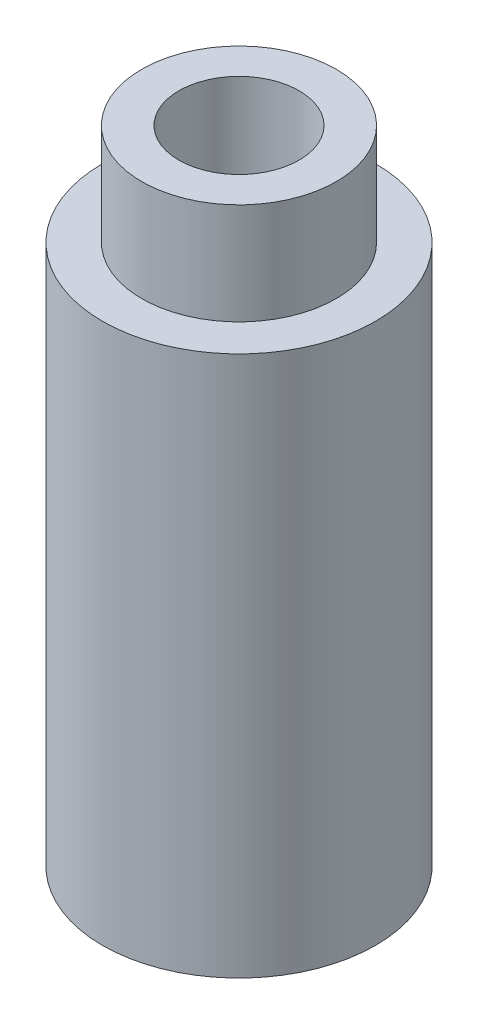
ISO-10303-21;
HEADER;
FILE_DESCRIPTION(('STEP AP214'),'2;1');
FILE_NAME('part.step','',(''),(''),'','','');
FILE_SCHEMA(('AUTOMOTIVE_DESIGN { 1 0 10303 214 1 1 1 1 }'));
ENDSEC;
DATA;
#1=APPLICATION_CONTEXT('core data for automotive mechanical design processes');
#2=APPLICATION_PROTOCOL_DEFINITION('international standard','automotive_design',2000,#1);
#3=PRODUCT_CONTEXT('',#1,'mechanical');
#4=PRODUCT('Part','Part','',(#3));
#5=PRODUCT_RELATED_PRODUCT_CATEGORY('part','',(#4));
#6=PRODUCT_DEFINITION_FORMATION('','',#4);
#7=PRODUCT_DEFINITION_CONTEXT('part definition',#1,'design');
#8=PRODUCT_DEFINITION('design','',#6,#7);
#9=PRODUCT_DEFINITION_SHAPE('','',#8);
#10=(LENGTH_UNIT() NAMED_UNIT(*) SI_UNIT(.MILLI.,.METRE.));
#11=(NAMED_UNIT(*) PLANE_ANGLE_UNIT() SI_UNIT($,.RADIAN.));
#12=(NAMED_UNIT(*) SI_UNIT($,.STERADIAN.) SOLID_ANGLE_UNIT());
#13=UNCERTAINTY_MEASURE_WITH_UNIT(LENGTH_MEASURE(1.E-05),#10,'distance_accuracy_value','');
#14=(GEOMETRIC_REPRESENTATION_CONTEXT(3) GLOBAL_UNCERTAINTY_ASSIGNED_CONTEXT((#13)) GLOBAL_UNIT_ASSIGNED_CONTEXT((#10,
#11,#12)) REPRESENTATION_CONTEXT('',''));
#15=CARTESIAN_POINT('',(0.,0.,0.));
#16=DIRECTION('',(0.,0.,1.));
#17=DIRECTION('',(1.,0.,0.));
#18=AXIS2_PLACEMENT_3D('',#15,#16,#17);
#19=CARTESIAN_POINT('',(0.,50.8,0.));
#20=DIRECTION('',(0.,-1.,0.));
#21=DIRECTION('',(0.,0.,-1.));
#22=AXIS2_PLACEMENT_3D('',#19,#20,#21);
#23=CYLINDRICAL_SURFACE('',#22,12.827);
#24=CARTESIAN_POINT('',(0.,50.8,0.));
#25=DIRECTION('',(0.,1.,0.));
#26=DIRECTION('',(0.,0.,1.));
#27=AXIS2_PLACEMENT_3D('',#24,#25,#26);
#28=CIRCLE('',#27,12.827);
#29=CARTESIAN_POINT('',(0.,50.8,12.827));
#30=VERTEX_POINT('',#29);
#31=EDGE_CURVE('E51',#30,#30,#28,.T.);
#32=ORIENTED_EDGE('',*,*,#31,.F.);
#33=EDGE_LOOP('',(#32));
#34=FACE_BOUND('',#33,.T.);
#35=CARTESIAN_POINT('',(0.,0.,0.));
#36=DIRECTION('',(0.,1.,0.));
#37=DIRECTION('',(0.,0.,1.));
#38=AXIS2_PLACEMENT_3D('',#35,#36,#37);
#39=CIRCLE('',#38,12.827);
#40=CARTESIAN_POINT('',(0.,0.,12.827));
#41=VERTEX_POINT('',#40);
#42=EDGE_CURVE('E46',#41,#41,#39,.T.);
#43=ORIENTED_EDGE('',*,*,#42,.T.);
#44=EDGE_LOOP('',(#43));
#45=FACE_BOUND('',#44,.T.);
#46=ADVANCED_FACE('F43',(#34,#45),#23,.T.);
#47=CARTESIAN_POINT('',(0.,50.8,0.));
#48=DIRECTION('',(0.,1.,0.));
#49=DIRECTION('',(0.,0.,1.));
#50=AXIS2_PLACEMENT_3D('',#47,#48,#49);
#51=PLANE('',#50);
#52=CARTESIAN_POINT('',(0.,50.8,0.));
#53=DIRECTION('',(0.,1.,0.));
#54=DIRECTION('',(0.,0.,1.));
#55=AXIS2_PLACEMENT_3D('',#52,#53,#54);
#56=CIRCLE('',#55,9.144);
#57=CARTESIAN_POINT('',(0.,50.8,-9.144));
#58=VERTEX_POINT('',#57);
#59=EDGE_CURVE('E10',#58,#58,#56,.T.);
#60=ORIENTED_EDGE('',*,*,#59,.F.);
#61=EDGE_LOOP('',(#60));
#62=FACE_BOUND('',#61,.T.);
#63=ORIENTED_EDGE('',*,*,#31,.T.);
#64=EDGE_LOOP('',(#63));
#65=FACE_BOUND('',#64,.T.);
#66=ADVANCED_FACE('F93',(#62,#65),#51,.T.);
#67=CARTESIAN_POINT('',(0.,0.,0.));
#68=DIRECTION('',(0.,1.,0.));
#69=DIRECTION('',(0.,0.,1.));
#70=AXIS2_PLACEMENT_3D('',#67,#68,#69);
#71=PLANE('',#70);
#72=ORIENTED_EDGE('',*,*,#42,.F.);
#73=EDGE_LOOP('',(#72));
#74=FACE_BOUND('',#73,.T.);
#75=ADVANCED_FACE('F87',(#74),#71,.F.);
#76=CARTESIAN_POINT('',(0.,60.325,0.));
#77=DIRECTION('',(0.,-1.,0.));
#78=DIRECTION('',(0.,0.,-1.));
#79=AXIS2_PLACEMENT_3D('',#76,#77,#78);
#80=CYLINDRICAL_SURFACE('',#79,9.144);
#81=CARTESIAN_POINT('',(0.,60.325,0.));
#82=DIRECTION('',(0.,1.,0.));
#83=DIRECTION('',(0.,0.,1.));
#84=AXIS2_PLACEMENT_3D('',#81,#82,#83);
#85=CIRCLE('',#84,9.144);
#86=CARTESIAN_POINT('',(0.,60.325,-9.144));
#87=VERTEX_POINT('',#86);
#88=EDGE_CURVE('E58',#87,#87,#85,.T.);
#89=CARTESIAN_POINT('',(0.,60.325,-9.144));
#90=CARTESIAN_POINT('',(0.,60.22578125,-9.144));
#91=CARTESIAN_POINT('',(0.,60.1265625,-9.144));
#92=CARTESIAN_POINT('',(0.,59.928125,-9.144));
#93=CARTESIAN_POINT('',(0.,59.82890625,-9.144));
#94=CARTESIAN_POINT('',(0.,59.63046875,-9.144));
#95=CARTESIAN_POINT('',(0.,59.53125,-9.144));
#96=CARTESIAN_POINT('',(0.,59.3328125,-9.144));
#97=CARTESIAN_POINT('',(0.,59.23359375,-9.144));
#98=CARTESIAN_POINT('',(0.,59.03515625,-9.144));
#99=CARTESIAN_POINT('',(0.,58.9359375,-9.144));
#100=CARTESIAN_POINT('',(0.,58.7375,-9.144));
#101=CARTESIAN_POINT('',(0.,58.63828125,-9.144));
#102=CARTESIAN_POINT('',(0.,58.43984375,-9.144));
#103=CARTESIAN_POINT('',(0.,58.340625,-9.144));
#104=CARTESIAN_POINT('',(0.,58.1421875,-9.144));
#105=CARTESIAN_POINT('',(0.,58.04296875,-9.144));
#106=CARTESIAN_POINT('',(0.,57.84453125,-9.144));
#107=CARTESIAN_POINT('',(0.,57.7453125,-9.144));
#108=CARTESIAN_POINT('',(0.,57.546875,-9.144));
#109=CARTESIAN_POINT('',(0.,57.44765625,-9.144));
#110=CARTESIAN_POINT('',(0.,57.24921875,-9.144));
#111=CARTESIAN_POINT('',(0.,57.15,-9.144));
#112=CARTESIAN_POINT('',(0.,56.9515625,-9.144));
#113=CARTESIAN_POINT('',(0.,56.85234375,-9.144));
#114=CARTESIAN_POINT('',(0.,56.65390625,-9.144));
#115=CARTESIAN_POINT('',(0.,56.5546875,-9.144));
#116=CARTESIAN_POINT('',(0.,56.35625,-9.144));
#117=CARTESIAN_POINT('',(0.,56.25703125,-9.144));
#118=CARTESIAN_POINT('',(0.,56.05859375,-9.144));
#119=CARTESIAN_POINT('',(0.,55.959375,-9.144));
#120=CARTESIAN_POINT('',(0.,55.7609375,-9.144));
#121=CARTESIAN_POINT('',(0.,55.66171875,-9.144));
#122=CARTESIAN_POINT('',(0.,55.46328125,-9.144));
#123=CARTESIAN_POINT('',(0.,55.3640625,-9.144));
#124=CARTESIAN_POINT('',(0.,55.165625,-9.144));
#125=CARTESIAN_POINT('',(0.,55.06640625,-9.144));
#126=CARTESIAN_POINT('',(0.,54.86796875,-9.144));
#127=CARTESIAN_POINT('',(0.,54.76875,-9.144));
#128=CARTESIAN_POINT('',(0.,54.5703125,-9.144));
#129=CARTESIAN_POINT('',(0.,54.47109375,-9.144));
#130=CARTESIAN_POINT('',(0.,54.27265625,-9.144));
#131=CARTESIAN_POINT('',(0.,54.1734375,-9.144));
#132=CARTESIAN_POINT('',(0.,53.975,-9.144));
#133=CARTESIAN_POINT('',(0.,53.87578125,-9.144));
#134=CARTESIAN_POINT('',(0.,53.67734375,-9.144));
#135=CARTESIAN_POINT('',(0.,53.578125,-9.144));
#136=CARTESIAN_POINT('',(0.,53.3796875,-9.144));
#137=CARTESIAN_POINT('',(0.,53.28046875,-9.144));
#138=CARTESIAN_POINT('',(0.,53.08203125,-9.144));
#139=CARTESIAN_POINT('',(0.,52.9828125,-9.144));
#140=CARTESIAN_POINT('',(0.,52.784375,-9.144));
#141=CARTESIAN_POINT('',(0.,52.68515625,-9.144));
#142=CARTESIAN_POINT('',(0.,52.48671875,-9.144));
#143=CARTESIAN_POINT('',(0.,52.3875,-9.144));
#144=CARTESIAN_POINT('',(0.,52.1890625,-9.144));
#145=CARTESIAN_POINT('',(0.,52.08984375,-9.144));
#146=CARTESIAN_POINT('',(0.,51.89140625,-9.144));
#147=CARTESIAN_POINT('',(0.,51.7921875,-9.144));
#148=CARTESIAN_POINT('',(0.,51.59375,-9.144));
#149=CARTESIAN_POINT('',(0.,51.49453125,-9.144));
#150=CARTESIAN_POINT('',(0.,51.29609375,-9.144));
#151=CARTESIAN_POINT('',(0.,51.196875,-9.144));
#152=CARTESIAN_POINT('',(0.,50.9984375,-9.144));
#153=CARTESIAN_POINT('',(0.,50.89921875,-9.144));
#154=CARTESIAN_POINT('',(0.,50.8,-9.144));
#155=B_SPLINE_CURVE_WITH_KNOTS('',3,(#89,#90,#91,#92,#93,#94,#95,#96,#97,#98,#99,#100,#101,#102,
#103,#104,#105,#106,#107,#108,#109,#110,#111,#112,#113,#114,#115,#116,#117,#118,#119,#120,#121,
#122,#123,#124,#125,#126,#127,#128,#129,#130,#131,#132,#133,#134,#135,#136,#137,#138,#139,#140,
#141,#142,#143,#144,#145,#146,#147,#148,#149,#150,#151,#152,#153,#154),.UNSPECIFIED.,.F.,.F.,(4,
2,2,2,2,2,2,2,2,2,2,2,2,2,2,2,2,2,2,2,2,2,2,2,2,2,2,2,2,2,2,2,4),(0.,0.297656249999993,
0.595312499999993,0.892968749999994,1.19062499999999,1.48828124999999,1.78593749999999,
2.08359374999999,2.38124999999999,2.67890624999999,2.97656249999999,3.27421874999999,3.571875,
3.86953125,4.1671875,4.46484375,4.7625,5.06015625,5.3578125,5.65546875,5.953125,6.25078125,
6.5484375,6.84609375,7.14375,7.44140625,7.7390625,8.03671875,8.334375,8.63203125,8.9296875,
9.22734375,9.525),.UNSPECIFIED.);
#156=EDGE_CURVE('BSEAM82',#87,#58,#155,.T.);
#157=ORIENTED_EDGE('',*,*,#88,.F.);
#158=ORIENTED_EDGE('',*,*,#59,.T.);
#159=ORIENTED_EDGE('',*,*,#156,.T.);
#160=ORIENTED_EDGE('',*,*,#156,.F.);
#161=EDGE_LOOP('',(#157,#159,#158,#160));
#162=FACE_BOUND('',#161,.T.);
#163=ADVANCED_FACE('F82',(#162),#80,.T.);
#164=CARTESIAN_POINT('',(0.,60.325,0.));
#165=DIRECTION('',(0.,1.,0.));
#166=DIRECTION('',(0.,0.,1.));
#167=AXIS2_PLACEMENT_3D('',#164,#165,#166);
#168=PLANE('',#167);
#169=CARTESIAN_POINT('',(0.,60.325,0.));
#170=DIRECTION('',(0.,1.,0.));
#171=DIRECTION('',(0.,0.,1.));
#172=AXIS2_PLACEMENT_3D('',#169,#170,#171);
#173=CIRCLE('',#172,5.6515);
#174=CARTESIAN_POINT('',(0.,60.325,5.6515));
#175=VERTEX_POINT('',#174);
#176=EDGE_CURVE('E63',#175,#175,#173,.T.);
#177=ORIENTED_EDGE('',*,*,#176,.F.);
#178=EDGE_LOOP('',(#177));
#179=FACE_BOUND('',#178,.T.);
#180=ORIENTED_EDGE('',*,*,#88,.T.);
#181=EDGE_LOOP('',(#180));
#182=FACE_BOUND('',#181,.T.);
#183=ADVANCED_FACE('F76',(#179,#182),#168,.T.);
#184=CARTESIAN_POINT('',(0.,0.634999999999997,0.));
#185=DIRECTION('',(0.,1.,0.));
#186=DIRECTION('',(0.,0.,1.));
#187=AXIS2_PLACEMENT_3D('',#184,#185,#186);
#188=CYLINDRICAL_SURFACE('',#187,5.6515);
#189=CARTESIAN_POINT('',(0.,0.634999999999997,0.));
#190=DIRECTION('',(0.,1.,0.));
#191=DIRECTION('',(0.,0.,1.));
#192=AXIS2_PLACEMENT_3D('',#189,#190,#191);
#193=CIRCLE('',#192,5.6515);
#194=CARTESIAN_POINT('',(0.,0.634999999999997,5.6515));
#195=VERTEX_POINT('',#194);
#196=EDGE_CURVE('E62',#195,#195,#193,.T.);
#197=CARTESIAN_POINT('',(0.,0.634999999999997,5.6515));
#198=CARTESIAN_POINT('',(0.,1.25677083333333,5.6515));
#199=CARTESIAN_POINT('',(0.,1.87854166666666,5.6515));
#200=CARTESIAN_POINT('',(0.,3.12208333333333,5.6515));
#201=CARTESIAN_POINT('',(0.,3.74385416666666,5.6515));
#202=CARTESIAN_POINT('',(0.,4.98739583333333,5.6515));
#203=CARTESIAN_POINT('',(0.,5.60916666666666,5.6515));
#204=CARTESIAN_POINT('',(0.,6.85270833333333,5.6515));
#205=CARTESIAN_POINT('',(0.,7.47447916666666,5.6515));
#206=CARTESIAN_POINT('',(0.,8.71802083333333,5.6515));
#207=CARTESIAN_POINT('',(0.,9.33979166666666,5.6515));
#208=CARTESIAN_POINT('',(0.,10.5833333333333,5.6515));
#209=CARTESIAN_POINT('',(0.,11.2051041666667,5.6515));
#210=CARTESIAN_POINT('',(0.,12.4486458333333,5.6515));
#211=CARTESIAN_POINT('',(0.,13.0704166666667,5.6515));
#212=CARTESIAN_POINT('',(0.,14.3139583333333,5.6515));
#213=CARTESIAN_POINT('',(0.,14.9357291666667,5.6515));
#214=CARTESIAN_POINT('',(0.,16.1792708333333,5.6515));
#215=CARTESIAN_POINT('',(0.,16.8010416666667,5.6515));
#216=CARTESIAN_POINT('',(0.,18.0445833333333,5.6515));
#217=CARTESIAN_POINT('',(0.,18.6663541666667,5.6515));
#218=CARTESIAN_POINT('',(0.,19.9098958333333,5.6515));
#219=CARTESIAN_POINT('',(0.,20.5316666666667,5.6515));
#220=CARTESIAN_POINT('',(0.,21.7752083333333,5.6515));
#221=CARTESIAN_POINT('',(0.,22.3969791666667,5.6515));
#222=CARTESIAN_POINT('',(0.,23.6405208333333,5.6515));
#223=CARTESIAN_POINT('',(0.,24.2622916666667,5.6515));
#224=CARTESIAN_POINT('',(0.,25.5058333333333,5.6515));
#225=CARTESIAN_POINT('',(0.,26.1276041666667,5.6515));
#226=CARTESIAN_POINT('',(0.,27.3711458333333,5.6515));
#227=CARTESIAN_POINT('',(0.,27.9929166666667,5.6515));
#228=CARTESIAN_POINT('',(0.,29.2364583333333,5.6515));
#229=CARTESIAN_POINT('',(0.,29.8582291666667,5.6515));
#230=CARTESIAN_POINT('',(0.,31.1017708333333,5.6515));
#231=CARTESIAN_POINT('',(0.,31.7235416666667,5.6515));
#232=CARTESIAN_POINT('',(0.,32.9670833333333,5.6515));
#233=CARTESIAN_POINT('',(0.,33.5888541666667,5.6515));
#234=CARTESIAN_POINT('',(0.,34.8323958333333,5.6515));
#235=CARTESIAN_POINT('',(0.,35.4541666666667,5.6515));
#236=CARTESIAN_POINT('',(0.,36.6977083333333,5.6515));
#237=CARTESIAN_POINT('',(0.,37.3194791666667,5.6515));
#238=CARTESIAN_POINT('',(0.,38.5630208333333,5.6515));
#239=CARTESIAN_POINT('',(0.,39.1847916666667,5.6515));
#240=CARTESIAN_POINT('',(0.,40.4283333333333,5.6515));
#241=CARTESIAN_POINT('',(0.,41.0501041666667,5.6515));
#242=CARTESIAN_POINT('',(0.,42.2936458333333,5.6515));
#243=CARTESIAN_POINT('',(0.,42.9154166666667,5.6515));
#244=CARTESIAN_POINT('',(0.,44.1589583333333,5.6515));
#245=CARTESIAN_POINT('',(0.,44.7807291666667,5.6515));
#246=CARTESIAN_POINT('',(0.,46.0242708333333,5.6515));
#247=CARTESIAN_POINT('',(0.,46.6460416666667,5.6515));
#248=CARTESIAN_POINT('',(0.,47.8895833333333,5.6515));
#249=CARTESIAN_POINT('',(0.,48.5113541666667,5.6515));
#250=CARTESIAN_POINT('',(0.,49.7548958333333,5.6515));
#251=CARTESIAN_POINT('',(0.,50.3766666666667,5.6515));
#252=CARTESIAN_POINT('',(0.,51.6202083333333,5.6515));
#253=CARTESIAN_POINT('',(0.,52.2419791666667,5.6515));
#254=CARTESIAN_POINT('',(0.,53.4855208333333,5.6515));
#255=CARTESIAN_POINT('',(0.,54.1072916666667,5.6515));
#256=CARTESIAN_POINT('',(0.,55.3508333333333,5.6515));
#257=CARTESIAN_POINT('',(0.,55.9726041666667,5.6515));
#258=CARTESIAN_POINT('',(0.,57.2161458333333,5.6515));
#259=CARTESIAN_POINT('',(0.,57.8379166666667,5.6515));
#260=CARTESIAN_POINT('',(0.,59.0814583333333,5.6515));
#261=CARTESIAN_POINT('',(0.,59.7032291666667,5.6515));
#262=CARTESIAN_POINT('',(0.,60.325,5.6515));
#263=B_SPLINE_CURVE_WITH_KNOTS('',3,(#197,#198,#199,#200,#201,#202,#203,#204,#205,#206,#207,
#208,#209,#210,#211,#212,#213,#214,#215,#216,#217,#218,#219,#220,#221,#222,#223,#224,#225,#226,
#227,#228,#229,#230,#231,#232,#233,#234,#235,#236,#237,#238,#239,#240,#241,#242,#243,#244,#245,
#246,#247,#248,#249,#250,#251,#252,#253,#254,#255,#256,#257,#258,#259,#260,#261,#262),
.UNSPECIFIED.,.F.,.F.,(4,2,2,2,2,2,2,2,2,2,2,2,2,2,2,2,2,2,2,2,2,2,2,2,2,2,2,2,2,2,2,2,4),(0.,
1.8653125,3.730625,5.5959375,7.46125,9.3265625,11.191875,13.0571875,14.9225,16.7878125,
18.653125,20.5184375,22.38375,24.2490625,26.114375,27.9796875,29.845,31.7103125,33.575625,
35.4409375,37.30625,39.1715625,41.036875,42.9021875,44.7675,46.6328125,48.498125,50.3634375,
52.22875,54.0940625,55.959375,57.8246875,59.69),.UNSPECIFIED.);
#264=EDGE_CURVE('BSEAM73',#195,#175,#263,.T.);
#265=ORIENTED_EDGE('',*,*,#196,.F.);
#266=ORIENTED_EDGE('',*,*,#176,.T.);
#267=ORIENTED_EDGE('',*,*,#264,.T.);
#268=ORIENTED_EDGE('',*,*,#264,.F.);
#269=EDGE_LOOP('',(#265,#267,#266,#268));
#270=FACE_BOUND('',#269,.T.);
#271=ADVANCED_FACE('F73',(#270),#188,.F.);
#272=CARTESIAN_POINT('',(0.,0.634999999999997,0.));
#273=DIRECTION('',(0.,1.,0.));
#274=DIRECTION('',(0.,0.,1.));
#275=AXIS2_PLACEMENT_3D('',#272,#273,#274);
#276=PLANE('',#275);
#277=ORIENTED_EDGE('',*,*,#196,.T.);
#278=EDGE_LOOP('',(#277));
#279=FACE_BOUND('',#278,.T.);
#280=ADVANCED_FACE('F71',(#279),#276,.T.);
#281=CLOSED_SHELL('',(#46,#66,#75,#163,#183,#271,#280));
#282=MANIFOLD_SOLID_BREP('B2',#281);
#283=ADVANCED_BREP_SHAPE_REPRESENTATION('',(#18,#282),#14);
#284=SHAPE_DEFINITION_REPRESENTATION(#9,#283);
ENDSEC;
END-ISO-10303-21;
